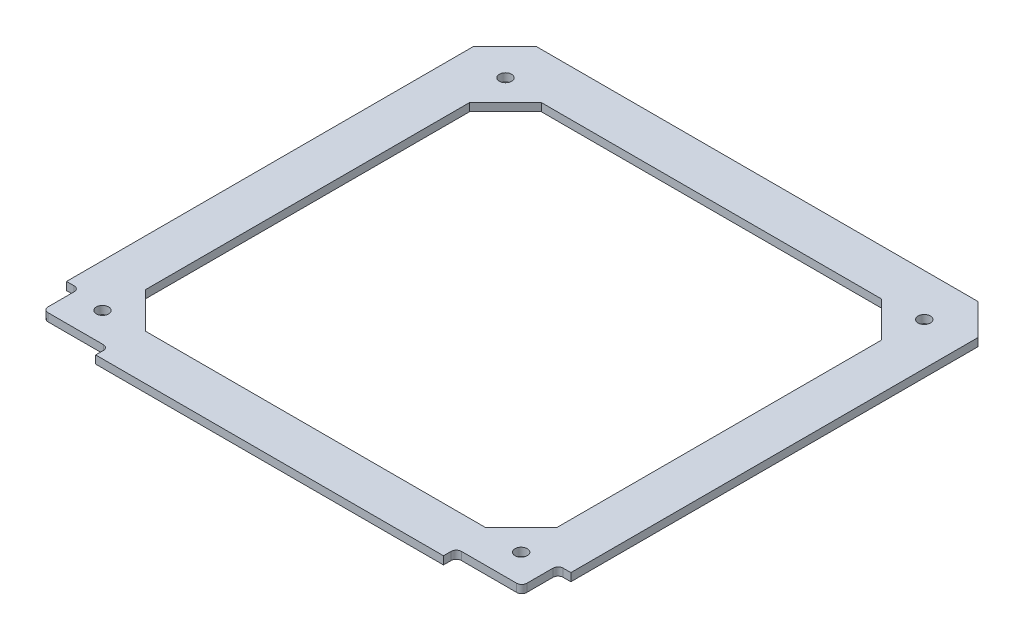
ISO-10303-21;
HEADER;
FILE_DESCRIPTION(('STEP AP214'),'2;1');
FILE_NAME('part.step','',(''),(''),'','','');
FILE_SCHEMA(('AUTOMOTIVE_DESIGN { 1 0 10303 214 1 1 1 1 }'));
ENDSEC;
DATA;
#1=APPLICATION_CONTEXT('core data for automotive mechanical design processes');
#2=APPLICATION_PROTOCOL_DEFINITION('international standard','automotive_design',2000,#1);
#3=PRODUCT_CONTEXT('',#1,'mechanical');
#4=PRODUCT('Part','Part','',(#3));
#5=PRODUCT_RELATED_PRODUCT_CATEGORY('part','',(#4));
#6=PRODUCT_DEFINITION_FORMATION('','',#4);
#7=PRODUCT_DEFINITION_CONTEXT('part definition',#1,'design');
#8=PRODUCT_DEFINITION('design','',#6,#7);
#9=PRODUCT_DEFINITION_SHAPE('','',#8);
#10=(LENGTH_UNIT() NAMED_UNIT(*) SI_UNIT(.MILLI.,.METRE.));
#11=(NAMED_UNIT(*) PLANE_ANGLE_UNIT() SI_UNIT($,.RADIAN.));
#12=(NAMED_UNIT(*) SI_UNIT($,.STERADIAN.) SOLID_ANGLE_UNIT());
#13=UNCERTAINTY_MEASURE_WITH_UNIT(LENGTH_MEASURE(1.E-05),#10,'distance_accuracy_value','');
#14=(GEOMETRIC_REPRESENTATION_CONTEXT(3) GLOBAL_UNCERTAINTY_ASSIGNED_CONTEXT((#13)) GLOBAL_UNIT_ASSIGNED_CONTEXT((#10,
#11,#12)) REPRESENTATION_CONTEXT('',''));
#15=CARTESIAN_POINT('',(0.,0.,0.));
#16=DIRECTION('',(0.,0.,1.));
#17=DIRECTION('',(1.,0.,0.));
#18=AXIS2_PLACEMENT_3D('',#15,#16,#17);
#19=CARTESIAN_POINT('',(-49.3566851962752,1.56,37.9952119756082));
#20=DIRECTION('',(1.,0.,0.));
#21=DIRECTION('',(0.,0.,-1.));
#22=AXIS2_PLACEMENT_3D('',#19,#20,#21);
#23=PLANE('',#22);
#24=DIRECTION('',(0.,0.,1.));
#25=VECTOR('',#24,1.);
#26=CARTESIAN_POINT('',(-49.3566851962752,0.,37.9952119756082));
#27=LINE('',#26,#25);
#28=CARTESIAN_POINT('',(-49.3566851962752,0.,-41.6047880243918));
#29=VERTEX_POINT('',#28);
#30=CARTESIAN_POINT('',(-49.3566851962752,0.,37.9952119756082));
#31=VERTEX_POINT('',#30);
#32=EDGE_CURVE('E280',#29,#31,#27,.T.);
#33=ORIENTED_EDGE('',*,*,#32,.T.);
#34=DIRECTION('',(0.,-1.,0.));
#35=VECTOR('',#34,1.);
#36=CARTESIAN_POINT('',(-49.3566851962752,1.56,37.9952119756082));
#37=LINE('',#36,#35);
#38=CARTESIAN_POINT('',(-49.3566851962752,1.56,37.9952119756082));
#39=VERTEX_POINT('',#38);
#40=EDGE_CURVE('E11',#39,#31,#37,.T.);
#41=ORIENTED_EDGE('',*,*,#40,.F.);
#42=DIRECTION('',(0.,0.,1.));
#43=VECTOR('',#42,1.);
#44=CARTESIAN_POINT('',(-49.3566851962752,1.56,37.9952119756082));
#45=LINE('',#44,#43);
#46=CARTESIAN_POINT('',(-49.3566851962752,1.56,-41.6047880243918));
#47=VERTEX_POINT('',#46);
#48=EDGE_CURVE('E292',#47,#39,#45,.T.);
#49=ORIENTED_EDGE('',*,*,#48,.F.);
#50=DIRECTION('',(0.,-1.,0.));
#51=VECTOR('',#50,1.);
#52=CARTESIAN_POINT('',(-49.3566851962752,1.56,-41.6047880243918));
#53=LINE('',#52,#51);
#54=EDGE_CURVE('E334',#47,#29,#53,.T.);
#55=ORIENTED_EDGE('',*,*,#54,.T.);
#56=EDGE_LOOP('',(#33,#41,#49,#55));
#57=FACE_BOUND('',#56,.T.);
#58=ADVANCED_FACE('F36',(#57),#23,.F.);
#59=CARTESIAN_POINT('',(-49.3566851962752,1.56,37.9952119756082));
#60=DIRECTION('',(0.,0.,-1.));
#61=DIRECTION('',(-1.,0.,0.));
#62=AXIS2_PLACEMENT_3D('',#59,#60,#61);
#63=PLANE('',#62);
#64=DIRECTION('',(1.,0.,0.));
#65=VECTOR('',#64,1.);
#66=CARTESIAN_POINT('',(-49.3566851962752,0.,37.9952119756082));
#67=LINE('',#66,#65);
#68=CARTESIAN_POINT('',(-47.8566851962753,0.,37.9952119756082));
#69=VERTEX_POINT('',#68);
#70=EDGE_CURVE('E337',#31,#69,#67,.T.);
#71=ORIENTED_EDGE('',*,*,#70,.T.);
#72=DIRECTION('',(0.,-1.,0.));
#73=VECTOR('',#72,1.);
#74=CARTESIAN_POINT('',(-47.8566851962753,1.56,37.9952119756082));
#75=LINE('',#74,#73);
#76=CARTESIAN_POINT('',(-47.8566851962753,1.56,37.9952119756082));
#77=VERTEX_POINT('',#76);
#78=EDGE_CURVE('E43',#77,#69,#75,.T.);
#79=ORIENTED_EDGE('',*,*,#78,.F.);
#80=DIRECTION('',(1.,0.,0.));
#81=VECTOR('',#80,1.);
#82=CARTESIAN_POINT('',(-49.3566851962752,1.56,37.9952119756082));
#83=LINE('',#82,#81);
#84=EDGE_CURVE('E295',#39,#77,#83,.T.);
#85=ORIENTED_EDGE('',*,*,#84,.F.);
#86=ORIENTED_EDGE('',*,*,#40,.T.);
#87=EDGE_LOOP('',(#71,#79,#85,#86));
#88=FACE_BOUND('',#87,.T.);
#89=ADVANCED_FACE('F452',(#88),#63,.F.);
#90=CARTESIAN_POINT('',(-47.8566851962752,1.56,38.9952119756082));
#91=DIRECTION('',(0.,-1.,0.));
#92=DIRECTION('',(0.,0.,-1.));
#93=AXIS2_PLACEMENT_3D('',#90,#91,#92);
#94=CYLINDRICAL_SURFACE('',#93,1.);
#95=CARTESIAN_POINT('',(-47.8566851962752,0.,38.9952119756082));
#96=DIRECTION('',(0.,-1.,0.));
#97=DIRECTION('',(0.,0.,1.));
#98=AXIS2_PLACEMENT_3D('',#95,#96,#97);
#99=CIRCLE('',#98,1.);
#100=CARTESIAN_POINT('',(-46.8566851962752,0.,38.9952119756082));
#101=VERTEX_POINT('',#100);
#102=EDGE_CURVE('E339',#69,#101,#99,.T.);
#103=ORIENTED_EDGE('',*,*,#102,.T.);
#104=DIRECTION('',(0.,-1.,0.));
#105=VECTOR('',#104,1.);
#106=CARTESIAN_POINT('',(-46.8566851962752,1.56,38.9952119756082));
#107=LINE('',#106,#105);
#108=CARTESIAN_POINT('',(-46.8566851962752,1.56,38.9952119756082));
#109=VERTEX_POINT('',#108);
#110=EDGE_CURVE('E424',#109,#101,#107,.T.);
#111=ORIENTED_EDGE('',*,*,#110,.F.);
#112=CARTESIAN_POINT('',(-47.8566851962752,1.56,38.9952119756082));
#113=DIRECTION('',(0.,-1.,0.));
#114=DIRECTION('',(0.,0.,1.));
#115=AXIS2_PLACEMENT_3D('',#112,#113,#114);
#116=CIRCLE('',#115,1.);
#117=EDGE_CURVE('E298',#77,#109,#116,.T.);
#118=ORIENTED_EDGE('',*,*,#117,.F.);
#119=ORIENTED_EDGE('',*,*,#78,.T.);
#120=EDGE_LOOP('',(#103,#111,#118,#119));
#121=FACE_BOUND('',#120,.T.);
#122=ADVANCED_FACE('F431',(#121),#94,.F.);
#123=CARTESIAN_POINT('',(-46.8566851962752,1.56,44.0952119756082));
#124=DIRECTION('',(1.,0.,0.));
#125=DIRECTION('',(0.,0.,-1.));
#126=AXIS2_PLACEMENT_3D('',#123,#124,#125);
#127=PLANE('',#126);
#128=DIRECTION('',(0.,0.,1.));
#129=VECTOR('',#128,1.);
#130=CARTESIAN_POINT('',(-46.8566851962752,0.,44.0952119756082));
#131=LINE('',#130,#129);
#132=CARTESIAN_POINT('',(-46.8566851962752,0.,44.0952119756082));
#133=VERTEX_POINT('',#132);
#134=EDGE_CURVE('E341',#101,#133,#131,.T.);
#135=ORIENTED_EDGE('',*,*,#134,.T.);
#136=DIRECTION('',(0.,-1.,0.));
#137=VECTOR('',#136,1.);
#138=CARTESIAN_POINT('',(-46.8566851962752,1.56,44.0952119756082));
#139=LINE('',#138,#137);
#140=CARTESIAN_POINT('',(-46.8566851962752,1.56,44.0952119756082));
#141=VERTEX_POINT('',#140);
#142=EDGE_CURVE('E421',#141,#133,#139,.T.);
#143=ORIENTED_EDGE('',*,*,#142,.F.);
#144=DIRECTION('',(0.,0.,1.));
#145=VECTOR('',#144,1.);
#146=CARTESIAN_POINT('',(-46.8566851962752,1.56,44.0952119756082));
#147=LINE('',#146,#145);
#148=EDGE_CURVE('E300',#109,#141,#147,.T.);
#149=ORIENTED_EDGE('',*,*,#148,.F.);
#150=ORIENTED_EDGE('',*,*,#110,.T.);
#151=EDGE_LOOP('',(#135,#143,#149,#150));
#152=FACE_BOUND('',#151,.T.);
#153=ADVANCED_FACE('F440',(#152),#127,.F.);
#154=CARTESIAN_POINT('',(-45.8566851962752,1.56,44.0952119756082));
#155=DIRECTION('',(0.,-1.,0.));
#156=DIRECTION('',(0.,0.,-1.));
#157=AXIS2_PLACEMENT_3D('',#154,#155,#156);
#158=CYLINDRICAL_SURFACE('',#157,1.);
#159=CARTESIAN_POINT('',(-45.8566851962752,0.,44.0952119756082));
#160=DIRECTION('',(0.,1.,0.));
#161=DIRECTION('',(0.,0.,-1.));
#162=AXIS2_PLACEMENT_3D('',#159,#160,#161);
#163=CIRCLE('',#162,1.);
#164=CARTESIAN_POINT('',(-45.8566851962752,0.,45.0952119756082));
#165=VERTEX_POINT('',#164);
#166=EDGE_CURVE('E343',#133,#165,#163,.T.);
#167=ORIENTED_EDGE('',*,*,#166,.T.);
#168=DIRECTION('',(0.,-1.,0.));
#169=VECTOR('',#168,1.);
#170=CARTESIAN_POINT('',(-45.8566851962752,1.56,45.0952119756082));
#171=LINE('',#170,#169);
#172=CARTESIAN_POINT('',(-45.8566851962752,1.56,45.0952119756082));
#173=VERTEX_POINT('',#172);
#174=EDGE_CURVE('E418',#173,#165,#171,.T.);
#175=ORIENTED_EDGE('',*,*,#174,.F.);
#176=CARTESIAN_POINT('',(-45.8566851962752,1.56,44.0952119756082));
#177=DIRECTION('',(0.,1.,0.));
#178=DIRECTION('',(0.,0.,-1.));
#179=AXIS2_PLACEMENT_3D('',#176,#177,#178);
#180=CIRCLE('',#179,1.);
#181=EDGE_CURVE('E302',#141,#173,#180,.T.);
#182=ORIENTED_EDGE('',*,*,#181,.F.);
#183=ORIENTED_EDGE('',*,*,#142,.T.);
#184=EDGE_LOOP('',(#167,#175,#182,#183));
#185=FACE_BOUND('',#184,.T.);
#186=ADVANCED_FACE('F444',(#185),#158,.T.);
#187=CARTESIAN_POINT('',(-45.8566851962752,1.56,45.0952119756082));
#188=DIRECTION('',(0.,0.,-1.));
#189=DIRECTION('',(-1.,0.,0.));
#190=AXIS2_PLACEMENT_3D('',#187,#188,#189);
#191=PLANE('',#190);
#192=DIRECTION('',(1.,0.,0.));
#193=VECTOR('',#192,1.);
#194=CARTESIAN_POINT('',(-45.8566851962752,0.,45.0952119756082));
#195=LINE('',#194,#193);
#196=CARTESIAN_POINT('',(-35.0566851962753,0.,45.0952119756082));
#197=VERTEX_POINT('',#196);
#198=EDGE_CURVE('E345',#165,#197,#195,.T.);
#199=ORIENTED_EDGE('',*,*,#198,.T.);
#200=DIRECTION('',(0.,-1.,0.));
#201=VECTOR('',#200,1.);
#202=CARTESIAN_POINT('',(-35.0566851962753,1.56,45.0952119756082));
#203=LINE('',#202,#201);
#204=CARTESIAN_POINT('',(-35.0566851962753,1.56,45.0952119756082));
#205=VERTEX_POINT('',#204);
#206=EDGE_CURVE('E415',#205,#197,#203,.T.);
#207=ORIENTED_EDGE('',*,*,#206,.F.);
#208=DIRECTION('',(1.,0.,0.));
#209=VECTOR('',#208,1.);
#210=CARTESIAN_POINT('',(-45.8566851962752,1.56,45.0952119756082));
#211=LINE('',#210,#209);
#212=EDGE_CURVE('E304',#173,#205,#211,.T.);
#213=ORIENTED_EDGE('',*,*,#212,.F.);
#214=ORIENTED_EDGE('',*,*,#174,.T.);
#215=EDGE_LOOP('',(#199,#207,#213,#214));
#216=FACE_BOUND('',#215,.T.);
#217=ADVANCED_FACE('F525',(#216),#191,.F.);
#218=CARTESIAN_POINT('',(-35.0566851962752,1.56,46.0952119756082));
#219=DIRECTION('',(0.,-1.,0.));
#220=DIRECTION('',(0.,0.,-1.));
#221=AXIS2_PLACEMENT_3D('',#218,#219,#220);
#222=CYLINDRICAL_SURFACE('',#221,1.);
#223=CARTESIAN_POINT('',(-35.0566851962752,0.,46.0952119756082));
#224=DIRECTION('',(0.,-1.,0.));
#225=DIRECTION('',(0.,0.,1.));
#226=AXIS2_PLACEMENT_3D('',#223,#224,#225);
#227=CIRCLE('',#226,1.);
#228=CARTESIAN_POINT('',(-34.0566851962752,0.,46.0952119756082));
#229=VERTEX_POINT('',#228);
#230=EDGE_CURVE('E347',#197,#229,#227,.T.);
#231=ORIENTED_EDGE('',*,*,#230,.T.);
#232=DIRECTION('',(0.,-1.,0.));
#233=VECTOR('',#232,1.);
#234=CARTESIAN_POINT('',(-34.0566851962752,1.56,46.0952119756082));
#235=LINE('',#234,#233);
#236=CARTESIAN_POINT('',(-34.0566851962752,1.56,46.0952119756082));
#237=VERTEX_POINT('',#236);
#238=EDGE_CURVE('E412',#237,#229,#235,.T.);
#239=ORIENTED_EDGE('',*,*,#238,.F.);
#240=CARTESIAN_POINT('',(-35.0566851962752,1.56,46.0952119756082));
#241=DIRECTION('',(0.,-1.,0.));
#242=DIRECTION('',(0.,0.,1.));
#243=AXIS2_PLACEMENT_3D('',#240,#241,#242);
#244=CIRCLE('',#243,1.);
#245=EDGE_CURVE('E306',#205,#237,#244,.T.);
#246=ORIENTED_EDGE('',*,*,#245,.F.);
#247=ORIENTED_EDGE('',*,*,#206,.T.);
#248=EDGE_LOOP('',(#231,#239,#246,#247));
#249=FACE_BOUND('',#248,.T.);
#250=ADVANCED_FACE('F523',(#249),#222,.F.);
#251=CARTESIAN_POINT('',(-34.0566851962752,1.56,47.5952119756082));
#252=DIRECTION('',(1.,0.,0.));
#253=DIRECTION('',(0.,0.,-1.));
#254=AXIS2_PLACEMENT_3D('',#251,#252,#253);
#255=PLANE('',#254);
#256=DIRECTION('',(0.,0.,1.));
#257=VECTOR('',#256,1.);
#258=CARTESIAN_POINT('',(-34.0566851962752,0.,47.5952119756082));
#259=LINE('',#258,#257);
#260=CARTESIAN_POINT('',(-34.0566851962752,0.,47.5952119756082));
#261=VERTEX_POINT('',#260);
#262=EDGE_CURVE('E349',#229,#261,#259,.T.);
#263=ORIENTED_EDGE('',*,*,#262,.T.);
#264=DIRECTION('',(0.,-1.,0.));
#265=VECTOR('',#264,1.);
#266=CARTESIAN_POINT('',(-34.0566851962752,1.56,47.5952119756082));
#267=LINE('',#266,#265);
#268=CARTESIAN_POINT('',(-34.0566851962752,1.56,47.5952119756082));
#269=VERTEX_POINT('',#268);
#270=EDGE_CURVE('E409',#269,#261,#267,.T.);
#271=ORIENTED_EDGE('',*,*,#270,.F.);
#272=DIRECTION('',(0.,0.,1.));
#273=VECTOR('',#272,1.);
#274=CARTESIAN_POINT('',(-34.0566851962752,1.56,47.5952119756082));
#275=LINE('',#274,#273);
#276=EDGE_CURVE('E308',#237,#269,#275,.T.);
#277=ORIENTED_EDGE('',*,*,#276,.F.);
#278=ORIENTED_EDGE('',*,*,#238,.T.);
#279=EDGE_LOOP('',(#263,#271,#277,#278));
#280=FACE_BOUND('',#279,.T.);
#281=ADVANCED_FACE('F518',(#280),#255,.F.);
#282=CARTESIAN_POINT('',(-34.0566851962752,1.56,47.5952119756082));
#283=DIRECTION('',(0.,0.,-1.));
#284=DIRECTION('',(-1.,0.,0.));
#285=AXIS2_PLACEMENT_3D('',#282,#283,#284);
#286=PLANE('',#285);
#287=DIRECTION('',(1.,0.,0.));
#288=VECTOR('',#287,1.);
#289=CARTESIAN_POINT('',(-34.0566851962752,0.,47.5952119756082));
#290=LINE('',#289,#288);
#291=CARTESIAN_POINT('',(33.9433148037247,0.,47.5952119756082));
#292=VERTEX_POINT('',#291);
#293=EDGE_CURVE('E351',#261,#292,#290,.T.);
#294=ORIENTED_EDGE('',*,*,#293,.T.);
#295=DIRECTION('',(0.,-1.,0.));
#296=VECTOR('',#295,1.);
#297=CARTESIAN_POINT('',(33.9433148037247,1.56,47.5952119756082));
#298=LINE('',#297,#296);
#299=CARTESIAN_POINT('',(33.9433148037247,1.56,47.5952119756082));
#300=VERTEX_POINT('',#299);
#301=EDGE_CURVE('E406',#300,#292,#298,.T.);
#302=ORIENTED_EDGE('',*,*,#301,.F.);
#303=DIRECTION('',(1.,0.,0.));
#304=VECTOR('',#303,1.);
#305=CARTESIAN_POINT('',(-34.0566851962752,1.56,47.5952119756082));
#306=LINE('',#305,#304);
#307=EDGE_CURVE('E310',#269,#300,#306,.T.);
#308=ORIENTED_EDGE('',*,*,#307,.F.);
#309=ORIENTED_EDGE('',*,*,#270,.T.);
#310=EDGE_LOOP('',(#294,#302,#308,#309));
#311=FACE_BOUND('',#310,.T.);
#312=ADVANCED_FACE('F513',(#311),#286,.F.);
#313=CARTESIAN_POINT('',(33.9433148037247,1.56,47.5952119756082));
#314=DIRECTION('',(-1.,0.,0.));
#315=DIRECTION('',(0.,0.,1.));
#316=AXIS2_PLACEMENT_3D('',#313,#314,#315);
#317=PLANE('',#316);
#318=DIRECTION('',(0.,0.,-1.));
#319=VECTOR('',#318,1.);
#320=CARTESIAN_POINT('',(33.9433148037247,0.,47.5952119756082));
#321=LINE('',#320,#319);
#322=CARTESIAN_POINT('',(33.9433148037247,0.,46.0952119756082));
#323=VERTEX_POINT('',#322);
#324=EDGE_CURVE('E353',#292,#323,#321,.T.);
#325=ORIENTED_EDGE('',*,*,#324,.T.);
#326=DIRECTION('',(0.,-1.,0.));
#327=VECTOR('',#326,1.);
#328=CARTESIAN_POINT('',(33.9433148037247,1.56,46.0952119756082));
#329=LINE('',#328,#327);
#330=CARTESIAN_POINT('',(33.9433148037247,1.56,46.0952119756082));
#331=VERTEX_POINT('',#330);
#332=EDGE_CURVE('E403',#331,#323,#329,.T.);
#333=ORIENTED_EDGE('',*,*,#332,.F.);
#334=DIRECTION('',(0.,0.,-1.));
#335=VECTOR('',#334,1.);
#336=CARTESIAN_POINT('',(33.9433148037247,1.56,47.5952119756082));
#337=LINE('',#336,#335);
#338=EDGE_CURVE('E312',#300,#331,#337,.T.);
#339=ORIENTED_EDGE('',*,*,#338,.F.);
#340=ORIENTED_EDGE('',*,*,#301,.T.);
#341=EDGE_LOOP('',(#325,#333,#339,#340));
#342=FACE_BOUND('',#341,.T.);
#343=ADVANCED_FACE('F509',(#342),#317,.F.);
#344=CARTESIAN_POINT('',(34.9433148037247,1.56,46.0952119756082));
#345=DIRECTION('',(0.,-1.,0.));
#346=DIRECTION('',(0.,0.,-1.));
#347=AXIS2_PLACEMENT_3D('',#344,#345,#346);
#348=CYLINDRICAL_SURFACE('',#347,1.);
#349=CARTESIAN_POINT('',(34.9433148037247,0.,46.0952119756082));
#350=DIRECTION('',(0.,-1.,0.));
#351=DIRECTION('',(0.,0.,1.));
#352=AXIS2_PLACEMENT_3D('',#349,#350,#351);
#353=CIRCLE('',#352,1.);
#354=CARTESIAN_POINT('',(34.9433148037248,0.,45.0952119756082));
#355=VERTEX_POINT('',#354);
#356=EDGE_CURVE('E355',#323,#355,#353,.T.);
#357=ORIENTED_EDGE('',*,*,#356,.T.);
#358=DIRECTION('',(0.,-1.,0.));
#359=VECTOR('',#358,1.);
#360=CARTESIAN_POINT('',(34.9433148037248,1.56,45.0952119756082));
#361=LINE('',#360,#359);
#362=CARTESIAN_POINT('',(34.9433148037248,1.56,45.0952119756082));
#363=VERTEX_POINT('',#362);
#364=EDGE_CURVE('E400',#363,#355,#361,.T.);
#365=ORIENTED_EDGE('',*,*,#364,.F.);
#366=CARTESIAN_POINT('',(34.9433148037247,1.56,46.0952119756082));
#367=DIRECTION('',(0.,-1.,0.));
#368=DIRECTION('',(0.,0.,1.));
#369=AXIS2_PLACEMENT_3D('',#366,#367,#368);
#370=CIRCLE('',#369,1.);
#371=EDGE_CURVE('E314',#331,#363,#370,.T.);
#372=ORIENTED_EDGE('',*,*,#371,.F.);
#373=ORIENTED_EDGE('',*,*,#332,.T.);
#374=EDGE_LOOP('',(#357,#365,#372,#373));
#375=FACE_BOUND('',#374,.T.);
#376=ADVANCED_FACE('F504',(#375),#348,.F.);
#377=CARTESIAN_POINT('',(34.9433148037248,1.56,45.0952119756082));
#378=DIRECTION('',(0.,0.,-1.));
#379=DIRECTION('',(-1.,0.,0.));
#380=AXIS2_PLACEMENT_3D('',#377,#378,#379);
#381=PLANE('',#380);
#382=DIRECTION('',(1.,0.,0.));
#383=VECTOR('',#382,1.);
#384=CARTESIAN_POINT('',(34.9433148037248,0.,45.0952119756082));
#385=LINE('',#384,#383);
#386=CARTESIAN_POINT('',(45.7433148037247,0.,45.0952119756082));
#387=VERTEX_POINT('',#386);
#388=EDGE_CURVE('E357',#355,#387,#385,.T.);
#389=ORIENTED_EDGE('',*,*,#388,.T.);
#390=DIRECTION('',(0.,-1.,0.));
#391=VECTOR('',#390,1.);
#392=CARTESIAN_POINT('',(45.7433148037247,1.56,45.0952119756082));
#393=LINE('',#392,#391);
#394=CARTESIAN_POINT('',(45.7433148037247,1.56,45.0952119756082));
#395=VERTEX_POINT('',#394);
#396=EDGE_CURVE('E397',#395,#387,#393,.T.);
#397=ORIENTED_EDGE('',*,*,#396,.F.);
#398=DIRECTION('',(1.,0.,0.));
#399=VECTOR('',#398,1.);
#400=CARTESIAN_POINT('',(34.9433148037248,1.56,45.0952119756082));
#401=LINE('',#400,#399);
#402=EDGE_CURVE('E316',#363,#395,#401,.T.);
#403=ORIENTED_EDGE('',*,*,#402,.F.);
#404=ORIENTED_EDGE('',*,*,#364,.T.);
#405=EDGE_LOOP('',(#389,#397,#403,#404));
#406=FACE_BOUND('',#405,.T.);
#407=ADVANCED_FACE('F498',(#406),#381,.F.);
#408=CARTESIAN_POINT('',(45.7433148037247,1.56,44.0952119756082));
#409=DIRECTION('',(0.,-1.,0.));
#410=DIRECTION('',(0.,0.,-1.));
#411=AXIS2_PLACEMENT_3D('',#408,#409,#410);
#412=CYLINDRICAL_SURFACE('',#411,1.);
#413=CARTESIAN_POINT('',(45.7433148037247,0.,44.0952119756082));
#414=DIRECTION('',(0.,1.,0.));
#415=DIRECTION('',(0.,0.,-1.));
#416=AXIS2_PLACEMENT_3D('',#413,#414,#415);
#417=CIRCLE('',#416,1.);
#418=CARTESIAN_POINT('',(46.7433148037248,0.,44.0952119756082));
#419=VERTEX_POINT('',#418);
#420=EDGE_CURVE('E359',#387,#419,#417,.T.);
#421=ORIENTED_EDGE('',*,*,#420,.T.);
#422=DIRECTION('',(0.,-1.,0.));
#423=VECTOR('',#422,1.);
#424=CARTESIAN_POINT('',(46.7433148037248,1.56,44.0952119756082));
#425=LINE('',#424,#423);
#426=CARTESIAN_POINT('',(46.7433148037248,1.56,44.0952119756082));
#427=VERTEX_POINT('',#426);
#428=EDGE_CURVE('E394',#427,#419,#425,.T.);
#429=ORIENTED_EDGE('',*,*,#428,.F.);
#430=CARTESIAN_POINT('',(45.7433148037247,1.56,44.0952119756082));
#431=DIRECTION('',(0.,1.,0.));
#432=DIRECTION('',(0.,0.,-1.));
#433=AXIS2_PLACEMENT_3D('',#430,#431,#432);
#434=CIRCLE('',#433,1.);
#435=EDGE_CURVE('E318',#395,#427,#434,.T.);
#436=ORIENTED_EDGE('',*,*,#435,.F.);
#437=ORIENTED_EDGE('',*,*,#396,.T.);
#438=EDGE_LOOP('',(#421,#429,#436,#437));
#439=FACE_BOUND('',#438,.T.);
#440=ADVANCED_FACE('F494',(#439),#412,.T.);
#441=CARTESIAN_POINT('',(46.7433148037248,1.56,44.0952119756082));
#442=DIRECTION('',(-1.,0.,0.));
#443=DIRECTION('',(0.,0.,1.));
#444=AXIS2_PLACEMENT_3D('',#441,#442,#443);
#445=PLANE('',#444);
#446=DIRECTION('',(0.,0.,-1.));
#447=VECTOR('',#446,1.);
#448=CARTESIAN_POINT('',(46.7433148037248,0.,44.0952119756082));
#449=LINE('',#448,#447);
#450=CARTESIAN_POINT('',(46.7433148037248,0.,38.9952119756082));
#451=VERTEX_POINT('',#450);
#452=EDGE_CURVE('E361',#419,#451,#449,.T.);
#453=ORIENTED_EDGE('',*,*,#452,.T.);
#454=DIRECTION('',(0.,-1.,0.));
#455=VECTOR('',#454,1.);
#456=CARTESIAN_POINT('',(46.7433148037248,1.56,38.9952119756082));
#457=LINE('',#456,#455);
#458=CARTESIAN_POINT('',(46.7433148037248,1.56,38.9952119756082));
#459=VERTEX_POINT('',#458);
#460=EDGE_CURVE('E391',#459,#451,#457,.T.);
#461=ORIENTED_EDGE('',*,*,#460,.F.);
#462=DIRECTION('',(0.,0.,-1.));
#463=VECTOR('',#462,1.);
#464=CARTESIAN_POINT('',(46.7433148037248,1.56,44.0952119756082));
#465=LINE('',#464,#463);
#466=EDGE_CURVE('E320',#427,#459,#465,.T.);
#467=ORIENTED_EDGE('',*,*,#466,.F.);
#468=ORIENTED_EDGE('',*,*,#428,.T.);
#469=EDGE_LOOP('',(#453,#461,#467,#468));
#470=FACE_BOUND('',#469,.T.);
#471=ADVANCED_FACE('F489',(#470),#445,.F.);
#472=CARTESIAN_POINT('',(47.7433148037248,1.56,38.9952119756082));
#473=DIRECTION('',(0.,-1.,0.));
#474=DIRECTION('',(0.,0.,-1.));
#475=AXIS2_PLACEMENT_3D('',#472,#473,#474);
#476=CYLINDRICAL_SURFACE('',#475,1.);
#477=CARTESIAN_POINT('',(47.7433148037248,0.,38.9952119756082));
#478=DIRECTION('',(0.,-1.,0.));
#479=DIRECTION('',(0.,0.,1.));
#480=AXIS2_PLACEMENT_3D('',#477,#478,#479);
#481=CIRCLE('',#480,1.);
#482=CARTESIAN_POINT('',(47.7433148037248,0.,37.9952119756082));
#483=VERTEX_POINT('',#482);
#484=EDGE_CURVE('E363',#451,#483,#481,.T.);
#485=ORIENTED_EDGE('',*,*,#484,.T.);
#486=DIRECTION('',(0.,-1.,0.));
#487=VECTOR('',#486,1.);
#488=CARTESIAN_POINT('',(47.7433148037248,1.56,37.9952119756082));
#489=LINE('',#488,#487);
#490=CARTESIAN_POINT('',(47.7433148037248,1.56,37.9952119756082));
#491=VERTEX_POINT('',#490);
#492=EDGE_CURVE('E388',#491,#483,#489,.T.);
#493=ORIENTED_EDGE('',*,*,#492,.F.);
#494=CARTESIAN_POINT('',(47.7433148037248,1.56,38.9952119756082));
#495=DIRECTION('',(0.,-1.,0.));
#496=DIRECTION('',(0.,0.,1.));
#497=AXIS2_PLACEMENT_3D('',#494,#495,#496);
#498=CIRCLE('',#497,1.);
#499=EDGE_CURVE('E322',#459,#491,#498,.T.);
#500=ORIENTED_EDGE('',*,*,#499,.F.);
#501=ORIENTED_EDGE('',*,*,#460,.T.);
#502=EDGE_LOOP('',(#485,#493,#500,#501));
#503=FACE_BOUND('',#502,.T.);
#504=ADVANCED_FACE('F483',(#503),#476,.F.);
#505=CARTESIAN_POINT('',(49.2433148037248,1.56,37.9952119756082));
#506=DIRECTION('',(0.,0.,-1.));
#507=DIRECTION('',(-1.,0.,0.));
#508=AXIS2_PLACEMENT_3D('',#505,#506,#507);
#509=PLANE('',#508);
#510=DIRECTION('',(1.,0.,0.));
#511=VECTOR('',#510,1.);
#512=CARTESIAN_POINT('',(49.2433148037248,0.,37.9952119756082));
#513=LINE('',#512,#511);
#514=CARTESIAN_POINT('',(49.2433148037248,0.,37.9952119756082));
#515=VERTEX_POINT('',#514);
#516=EDGE_CURVE('E365',#483,#515,#513,.T.);
#517=ORIENTED_EDGE('',*,*,#516,.T.);
#518=DIRECTION('',(0.,-1.,0.));
#519=VECTOR('',#518,1.);
#520=CARTESIAN_POINT('',(49.2433148037248,1.56,37.9952119756082));
#521=LINE('',#520,#519);
#522=CARTESIAN_POINT('',(49.2433148037248,1.56,37.9952119756082));
#523=VERTEX_POINT('',#522);
#524=EDGE_CURVE('E385',#523,#515,#521,.T.);
#525=ORIENTED_EDGE('',*,*,#524,.F.);
#526=DIRECTION('',(1.,0.,0.));
#527=VECTOR('',#526,1.);
#528=CARTESIAN_POINT('',(49.2433148037248,1.56,37.9952119756082));
#529=LINE('',#528,#527);
#530=EDGE_CURVE('E324',#491,#523,#529,.T.);
#531=ORIENTED_EDGE('',*,*,#530,.F.);
#532=ORIENTED_EDGE('',*,*,#492,.T.);
#533=EDGE_LOOP('',(#517,#525,#531,#532));
#534=FACE_BOUND('',#533,.T.);
#535=ADVANCED_FACE('F479',(#534),#509,.F.);
#536=CARTESIAN_POINT('',(49.2433148037248,1.56,37.9952119756082));
#537=DIRECTION('',(-1.,0.,0.));
#538=DIRECTION('',(0.,0.,1.));
#539=AXIS2_PLACEMENT_3D('',#536,#537,#538);
#540=PLANE('',#539);
#541=DIRECTION('',(0.,0.,-1.));
#542=VECTOR('',#541,1.);
#543=CARTESIAN_POINT('',(49.2433148037248,0.,37.9952119756082));
#544=LINE('',#543,#542);
#545=CARTESIAN_POINT('',(49.2433148037247,0.,-41.6047880243918));
#546=VERTEX_POINT('',#545);
#547=EDGE_CURVE('E367',#515,#546,#544,.T.);
#548=ORIENTED_EDGE('',*,*,#547,.T.);
#549=DIRECTION('',(0.,-1.,0.));
#550=VECTOR('',#549,1.);
#551=CARTESIAN_POINT('',(49.2433148037247,1.56,-41.6047880243918));
#552=LINE('',#551,#550);
#553=CARTESIAN_POINT('',(49.2433148037247,1.56,-41.6047880243918));
#554=VERTEX_POINT('',#553);
#555=EDGE_CURVE('E382',#554,#546,#552,.T.);
#556=ORIENTED_EDGE('',*,*,#555,.F.);
#557=DIRECTION('',(0.,0.,-1.));
#558=VECTOR('',#557,1.);
#559=CARTESIAN_POINT('',(49.2433148037248,1.56,37.9952119756082));
#560=LINE('',#559,#558);
#561=EDGE_CURVE('E326',#523,#554,#560,.T.);
#562=ORIENTED_EDGE('',*,*,#561,.F.);
#563=ORIENTED_EDGE('',*,*,#524,.T.);
#564=EDGE_LOOP('',(#548,#556,#562,#563));
#565=FACE_BOUND('',#564,.T.);
#566=ADVANCED_FACE('F474',(#565),#540,.F.);
#567=CARTESIAN_POINT('',(49.2433148037247,1.56,-41.6047880243918));
#568=DIRECTION('',(-0.707106781186547,0.,0.707106781186547));
#569=DIRECTION('',(0.707106781186548,0.,0.707106781186548));
#570=AXIS2_PLACEMENT_3D('',#567,#568,#569);
#571=PLANE('',#570);
#572=DIRECTION('',(-0.707106781186548,0.,-0.707106781186548));
#573=VECTOR('',#572,1.);
#574=CARTESIAN_POINT('',(49.2433148037247,0.,-41.6047880243918));
#575=LINE('',#574,#573);
#576=CARTESIAN_POINT('',(43.1433148037247,0.,-47.7047880243918));
#577=VERTEX_POINT('',#576);
#578=EDGE_CURVE('E369',#546,#577,#575,.T.);
#579=ORIENTED_EDGE('',*,*,#578,.T.);
#580=DIRECTION('',(0.,-1.,0.));
#581=VECTOR('',#580,1.);
#582=CARTESIAN_POINT('',(43.1433148037247,1.56,-47.7047880243918));
#583=LINE('',#582,#581);
#584=CARTESIAN_POINT('',(43.1433148037247,1.56,-47.7047880243918));
#585=VERTEX_POINT('',#584);
#586=EDGE_CURVE('E379',#585,#577,#583,.T.);
#587=ORIENTED_EDGE('',*,*,#586,.F.);
#588=DIRECTION('',(-0.707106781186548,0.,-0.707106781186548));
#589=VECTOR('',#588,1.);
#590=CARTESIAN_POINT('',(49.2433148037247,1.56,-41.6047880243918));
#591=LINE('',#590,#589);
#592=EDGE_CURVE('E328',#554,#585,#591,.T.);
#593=ORIENTED_EDGE('',*,*,#592,.F.);
#594=ORIENTED_EDGE('',*,*,#555,.T.);
#595=EDGE_LOOP('',(#579,#587,#593,#594));
#596=FACE_BOUND('',#595,.T.);
#597=ADVANCED_FACE('F468',(#596),#571,.F.);
#598=CARTESIAN_POINT('',(-43.2566851962752,1.56,-47.7047880243918));
#599=DIRECTION('',(0.,0.,1.));
#600=DIRECTION('',(1.,0.,0.));
#601=AXIS2_PLACEMENT_3D('',#598,#599,#600);
#602=PLANE('',#601);
#603=DIRECTION('',(-1.,0.,0.));
#604=VECTOR('',#603,1.);
#605=CARTESIAN_POINT('',(-43.2566851962752,0.,-47.7047880243918));
#606=LINE('',#605,#604);
#607=CARTESIAN_POINT('',(-43.2566851962752,0.,-47.7047880243918));
#608=VERTEX_POINT('',#607);
#609=EDGE_CURVE('E371',#577,#608,#606,.T.);
#610=ORIENTED_EDGE('',*,*,#609,.T.);
#611=DIRECTION('',(0.,-1.,0.));
#612=VECTOR('',#611,1.);
#613=CARTESIAN_POINT('',(-43.2566851962752,1.56,-47.7047880243918));
#614=LINE('',#613,#612);
#615=CARTESIAN_POINT('',(-43.2566851962752,1.56,-47.7047880243918));
#616=VERTEX_POINT('',#615);
#617=EDGE_CURVE('E376',#616,#608,#614,.T.);
#618=ORIENTED_EDGE('',*,*,#617,.F.);
#619=DIRECTION('',(-1.,0.,0.));
#620=VECTOR('',#619,1.);
#621=CARTESIAN_POINT('',(-43.2566851962752,1.56,-47.7047880243918));
#622=LINE('',#621,#620);
#623=EDGE_CURVE('E330',#585,#616,#622,.T.);
#624=ORIENTED_EDGE('',*,*,#623,.F.);
#625=ORIENTED_EDGE('',*,*,#586,.T.);
#626=EDGE_LOOP('',(#610,#618,#624,#625));
#627=FACE_BOUND('',#626,.T.);
#628=ADVANCED_FACE('F464',(#627),#602,.F.);
#629=CARTESIAN_POINT('',(-49.3566851962752,1.56,-41.6047880243918));
#630=DIRECTION('',(0.707106781186548,0.,0.707106781186547));
#631=DIRECTION('',(0.707106781186547,0.,-0.707106781186548));
#632=AXIS2_PLACEMENT_3D('',#629,#630,#631);
#633=PLANE('',#632);
#634=DIRECTION('',(-0.707106781186547,0.,0.707106781186548));
#635=VECTOR('',#634,1.);
#636=CARTESIAN_POINT('',(-49.3566851962752,0.,-41.6047880243918));
#637=LINE('',#636,#635);
#638=EDGE_CURVE('E296',#608,#29,#637,.T.);
#639=ORIENTED_EDGE('',*,*,#638,.T.);
#640=ORIENTED_EDGE('',*,*,#54,.F.);
#641=DIRECTION('',(-0.707106781186547,0.,0.707106781186548));
#642=VECTOR('',#641,1.);
#643=CARTESIAN_POINT('',(-49.3566851962752,1.56,-41.6047880243918));
#644=LINE('',#643,#642);
#645=EDGE_CURVE('E332',#616,#47,#644,.T.);
#646=ORIENTED_EDGE('',*,*,#645,.F.);
#647=ORIENTED_EDGE('',*,*,#617,.T.);
#648=EDGE_LOOP('',(#639,#640,#646,#647));
#649=FACE_BOUND('',#648,.T.);
#650=ADVANCED_FACE('F459',(#649),#633,.F.);
#651=CARTESIAN_POINT('',(47.7433148037248,1.56,38.9952119756082));
#652=DIRECTION('',(0.,1.,0.));
#653=DIRECTION('',(0.,0.,1.));
#654=AXIS2_PLACEMENT_3D('',#651,#652,#653);
#655=PLANE('',#654);
#656=CARTESIAN_POINT('',(40.9294911490461,1.56,-39.3973711595096));
#657=DIRECTION('',(0.,1.,0.));
#658=DIRECTION('',(0.,0.,1.));
#659=AXIS2_PLACEMENT_3D('',#656,#657,#658);
#660=CIRCLE('',#659,1.19999999999999);
#661=CARTESIAN_POINT('',(40.9294911490461,1.56,-38.1973711595096));
#662=VERTEX_POINT('',#661);
#663=EDGE_CURVE('E808',#662,#662,#660,.T.);
#664=ORIENTED_EDGE('',*,*,#663,.F.);
#665=EDGE_LOOP('',(#664));
#666=FACE_BOUND('',#665,.T.);
#667=CARTESIAN_POINT('',(40.9294911490461,1.56,39.3973711595096));
#668=DIRECTION('',(0.,1.,0.));
#669=DIRECTION('',(0.,0.,1.));
#670=AXIS2_PLACEMENT_3D('',#667,#668,#669);
#671=CIRCLE('',#670,1.19999999999999);
#672=CARTESIAN_POINT('',(40.9294911490461,1.56,40.5973711595096));
#673=VERTEX_POINT('',#672);
#674=EDGE_CURVE('E812',#673,#673,#671,.T.);
#675=ORIENTED_EDGE('',*,*,#674,.F.);
#676=EDGE_LOOP('',(#675));
#677=FACE_BOUND('',#676,.T.);
#678=CARTESIAN_POINT('',(-40.9294911490461,1.56,39.3973711595096));
#679=DIRECTION('',(0.,1.,0.));
#680=DIRECTION('',(0.,0.,1.));
#681=AXIS2_PLACEMENT_3D('',#678,#679,#680);
#682=CIRCLE('',#681,1.19999999999999);
#683=CARTESIAN_POINT('',(-40.9294911490461,1.56,40.5973711595096));
#684=VERTEX_POINT('',#683);
#685=EDGE_CURVE('E821',#684,#684,#682,.T.);
#686=ORIENTED_EDGE('',*,*,#685,.F.);
#687=EDGE_LOOP('',(#686));
#688=FACE_BOUND('',#687,.T.);
#689=CARTESIAN_POINT('',(-40.9294911490461,1.56,-39.3973711595096));
#690=DIRECTION('',(0.,1.,0.));
#691=DIRECTION('',(0.,0.,1.));
#692=AXIS2_PLACEMENT_3D('',#689,#690,#691);
#693=CIRCLE('',#692,1.19999999999999);
#694=CARTESIAN_POINT('',(-40.9294911490461,1.56,-38.1973711595096));
#695=VERTEX_POINT('',#694);
#696=EDGE_CURVE('E826',#695,#695,#693,.T.);
#697=ORIENTED_EDGE('',*,*,#696,.F.);
#698=EDGE_LOOP('',(#697));
#699=FACE_BOUND('',#698,.T.);
#700=DIRECTION('',(0.,0.,1.));
#701=VECTOR('',#700,1.);
#702=CARTESIAN_POINT('',(-40.2433148037248,1.56,31.7047880243918));
#703=LINE('',#702,#701);
#704=CARTESIAN_POINT('',(-40.2433148037248,1.56,-31.7047880243918));
#705=VERTEX_POINT('',#704);
#706=CARTESIAN_POINT('',(-40.2433148037248,1.56,31.7047880243918));
#707=VERTEX_POINT('',#706);
#708=EDGE_CURVE('E50',#705,#707,#703,.T.);
#709=ORIENTED_EDGE('',*,*,#708,.F.);
#710=DIRECTION('',(-0.707106781186547,0.,0.707106781186547));
#711=VECTOR('',#710,1.);
#712=CARTESIAN_POINT('',(-40.2433148037248,1.56,-31.7047880243918));
#713=LINE('',#712,#711);
#714=CARTESIAN_POINT('',(-33.2433148037248,1.56,-38.7047880243918));
#715=VERTEX_POINT('',#714);
#716=EDGE_CURVE('E239',#715,#705,#713,.T.);
#717=ORIENTED_EDGE('',*,*,#716,.F.);
#718=DIRECTION('',(-1.,0.,0.));
#719=VECTOR('',#718,1.);
#720=CARTESIAN_POINT('',(33.2433148037248,1.56,-38.7047880243918));
#721=LINE('',#720,#719);
#722=CARTESIAN_POINT('',(33.2433148037248,1.56,-38.7047880243918));
#723=VERTEX_POINT('',#722);
#724=EDGE_CURVE('E242',#723,#715,#721,.T.);
#725=ORIENTED_EDGE('',*,*,#724,.F.);
#726=DIRECTION('',(-0.707106781186547,0.,-0.707106781186547));
#727=VECTOR('',#726,1.);
#728=CARTESIAN_POINT('',(40.2433148037248,1.56,-31.7047880243918));
#729=LINE('',#728,#727);
#730=CARTESIAN_POINT('',(40.2433148037248,1.56,-31.7047880243918));
#731=VERTEX_POINT('',#730);
#732=EDGE_CURVE('E273',#731,#723,#729,.T.);
#733=ORIENTED_EDGE('',*,*,#732,.F.);
#734=DIRECTION('',(0.,0.,-1.));
#735=VECTOR('',#734,1.);
#736=CARTESIAN_POINT('',(40.2433148037248,1.56,31.7047880243918));
#737=LINE('',#736,#735);
#738=CARTESIAN_POINT('',(40.2433148037248,1.56,31.7047880243918));
#739=VERTEX_POINT('',#738);
#740=EDGE_CURVE('E270',#739,#731,#737,.T.);
#741=ORIENTED_EDGE('',*,*,#740,.F.);
#742=DIRECTION('',(0.707106781186547,0.,-0.707106781186547));
#743=VECTOR('',#742,1.);
#744=CARTESIAN_POINT('',(33.2433148037248,1.56,38.7047880243918));
#745=LINE('',#744,#743);
#746=CARTESIAN_POINT('',(33.2433148037248,1.56,38.7047880243918));
#747=VERTEX_POINT('',#746);
#748=EDGE_CURVE('E267',#747,#739,#745,.T.);
#749=ORIENTED_EDGE('',*,*,#748,.F.);
#750=DIRECTION('',(1.,0.,0.));
#751=VECTOR('',#750,1.);
#752=CARTESIAN_POINT('',(33.2433148037248,1.56,38.7047880243918));
#753=LINE('',#752,#751);
#754=CARTESIAN_POINT('',(-33.2433148037248,1.56,38.7047880243918));
#755=VERTEX_POINT('',#754);
#756=EDGE_CURVE('E264',#755,#747,#753,.T.);
#757=ORIENTED_EDGE('',*,*,#756,.F.);
#758=DIRECTION('',(0.707106781186547,0.,0.707106781186547));
#759=VECTOR('',#758,1.);
#760=CARTESIAN_POINT('',(-33.2433148037248,1.56,38.7047880243918));
#761=LINE('',#760,#759);
#762=EDGE_CURVE('E262',#707,#755,#761,.T.);
#763=ORIENTED_EDGE('',*,*,#762,.F.);
#764=EDGE_LOOP('',(#709,#717,#725,#733,#741,#749,#757,#763));
#765=FACE_BOUND('',#764,.T.);
#766=ORIENTED_EDGE('',*,*,#48,.T.);
#767=ORIENTED_EDGE('',*,*,#84,.T.);
#768=ORIENTED_EDGE('',*,*,#117,.T.);
#769=ORIENTED_EDGE('',*,*,#148,.T.);
#770=ORIENTED_EDGE('',*,*,#181,.T.);
#771=ORIENTED_EDGE('',*,*,#212,.T.);
#772=ORIENTED_EDGE('',*,*,#245,.T.);
#773=ORIENTED_EDGE('',*,*,#276,.T.);
#774=ORIENTED_EDGE('',*,*,#307,.T.);
#775=ORIENTED_EDGE('',*,*,#338,.T.);
#776=ORIENTED_EDGE('',*,*,#371,.T.);
#777=ORIENTED_EDGE('',*,*,#402,.T.);
#778=ORIENTED_EDGE('',*,*,#435,.T.);
#779=ORIENTED_EDGE('',*,*,#466,.T.);
#780=ORIENTED_EDGE('',*,*,#499,.T.);
#781=ORIENTED_EDGE('',*,*,#530,.T.);
#782=ORIENTED_EDGE('',*,*,#561,.T.);
#783=ORIENTED_EDGE('',*,*,#592,.T.);
#784=ORIENTED_EDGE('',*,*,#623,.T.);
#785=ORIENTED_EDGE('',*,*,#645,.T.);
#786=EDGE_LOOP('',(#766,#767,#768,#769,#770,#771,#772,#773,#774,#775,#776,#777,#778,#779,#780,
#781,#782,#783,#784,#785));
#787=FACE_BOUND('',#786,.T.);
#788=ADVANCED_FACE('F448',(#666,#677,#688,#699,#765,#787),#655,.T.);
#789=CARTESIAN_POINT('',(47.7433148037248,0.,38.9952119756082));
#790=DIRECTION('',(0.,1.,0.));
#791=DIRECTION('',(0.,0.,1.));
#792=AXIS2_PLACEMENT_3D('',#789,#790,#791);
#793=PLANE('',#792);
#794=CARTESIAN_POINT('',(40.9294911490461,0.,-39.3973711595096));
#795=DIRECTION('',(0.,1.,0.));
#796=DIRECTION('',(0.,0.,1.));
#797=AXIS2_PLACEMENT_3D('',#794,#795,#796);
#798=CIRCLE('',#797,1.19999999999999);
#799=CARTESIAN_POINT('',(40.9294911490461,0.,-38.1973711595096));
#800=VERTEX_POINT('',#799);
#801=EDGE_CURVE('E811',#800,#800,#798,.T.);
#802=ORIENTED_EDGE('',*,*,#801,.T.);
#803=EDGE_LOOP('',(#802));
#804=FACE_BOUND('',#803,.T.);
#805=CARTESIAN_POINT('',(40.9294911490461,0.,39.3973711595096));
#806=DIRECTION('',(0.,1.,0.));
#807=DIRECTION('',(0.,0.,1.));
#808=AXIS2_PLACEMENT_3D('',#805,#806,#807);
#809=CIRCLE('',#808,1.19999999999999);
#810=CARTESIAN_POINT('',(40.9294911490461,0.,40.5973711595096));
#811=VERTEX_POINT('',#810);
#812=EDGE_CURVE('E815',#811,#811,#809,.T.);
#813=ORIENTED_EDGE('',*,*,#812,.T.);
#814=EDGE_LOOP('',(#813));
#815=FACE_BOUND('',#814,.T.);
#816=CARTESIAN_POINT('',(-40.9294911490461,0.,39.3973711595096));
#817=DIRECTION('',(0.,1.,0.));
#818=DIRECTION('',(0.,0.,1.));
#819=AXIS2_PLACEMENT_3D('',#816,#817,#818);
#820=CIRCLE('',#819,1.19999999999999);
#821=CARTESIAN_POINT('',(-40.9294911490461,0.,40.5973711595096));
#822=VERTEX_POINT('',#821);
#823=EDGE_CURVE('E824',#822,#822,#820,.T.);
#824=ORIENTED_EDGE('',*,*,#823,.T.);
#825=EDGE_LOOP('',(#824));
#826=FACE_BOUND('',#825,.T.);
#827=CARTESIAN_POINT('',(-40.9294911490461,0.,-39.3973711595096));
#828=DIRECTION('',(0.,1.,0.));
#829=DIRECTION('',(0.,0.,1.));
#830=AXIS2_PLACEMENT_3D('',#827,#828,#829);
#831=CIRCLE('',#830,1.19999999999999);
#832=CARTESIAN_POINT('',(-40.9294911490461,0.,-38.1973711595096));
#833=VERTEX_POINT('',#832);
#834=EDGE_CURVE('E245',#833,#833,#831,.T.);
#835=ORIENTED_EDGE('',*,*,#834,.T.);
#836=EDGE_LOOP('',(#835));
#837=FACE_BOUND('',#836,.T.);
#838=DIRECTION('',(-0.707106781186547,0.,0.707106781186547));
#839=VECTOR('',#838,1.);
#840=CARTESIAN_POINT('',(-40.2433148037248,0.,-31.7047880243918));
#841=LINE('',#840,#839);
#842=CARTESIAN_POINT('',(-33.2433148037248,0.,-38.7047880243918));
#843=VERTEX_POINT('',#842);
#844=CARTESIAN_POINT('',(-40.2433148037248,0.,-31.7047880243918));
#845=VERTEX_POINT('',#844);
#846=EDGE_CURVE('E228',#843,#845,#841,.T.);
#847=ORIENTED_EDGE('',*,*,#846,.T.);
#848=DIRECTION('',(0.,0.,1.));
#849=VECTOR('',#848,1.);
#850=CARTESIAN_POINT('',(-40.2433148037248,0.,31.7047880243918));
#851=LINE('',#850,#849);
#852=CARTESIAN_POINT('',(-40.2433148037248,0.,31.7047880243918));
#853=VERTEX_POINT('',#852);
#854=EDGE_CURVE('E222',#845,#853,#851,.T.);
#855=ORIENTED_EDGE('',*,*,#854,.T.);
#856=DIRECTION('',(0.707106781186547,0.,0.707106781186547));
#857=VECTOR('',#856,1.);
#858=CARTESIAN_POINT('',(-33.2433148037248,0.,38.7047880243918));
#859=LINE('',#858,#857);
#860=CARTESIAN_POINT('',(-33.2433148037248,0.,38.7047880243918));
#861=VERTEX_POINT('',#860);
#862=EDGE_CURVE('E231',#853,#861,#859,.T.);
#863=ORIENTED_EDGE('',*,*,#862,.T.);
#864=DIRECTION('',(1.,0.,0.));
#865=VECTOR('',#864,1.);
#866=CARTESIAN_POINT('',(33.2433148037248,0.,38.7047880243918));
#867=LINE('',#866,#865);
#868=CARTESIAN_POINT('',(33.2433148037248,0.,38.7047880243918));
#869=VERTEX_POINT('',#868);
#870=EDGE_CURVE('E58',#861,#869,#867,.T.);
#871=ORIENTED_EDGE('',*,*,#870,.T.);
#872=DIRECTION('',(0.707106781186547,0.,-0.707106781186547));
#873=VECTOR('',#872,1.);
#874=CARTESIAN_POINT('',(33.2433148037248,0.,38.7047880243918));
#875=LINE('',#874,#873);
#876=CARTESIAN_POINT('',(40.2433148037248,0.,31.7047880243918));
#877=VERTEX_POINT('',#876);
#878=EDGE_CURVE('E249',#869,#877,#875,.T.);
#879=ORIENTED_EDGE('',*,*,#878,.T.);
#880=DIRECTION('',(0.,0.,-1.));
#881=VECTOR('',#880,1.);
#882=CARTESIAN_POINT('',(40.2433148037248,0.,31.7047880243918));
#883=LINE('',#882,#881);
#884=CARTESIAN_POINT('',(40.2433148037248,0.,-31.7047880243918));
#885=VERTEX_POINT('',#884);
#886=EDGE_CURVE('E252',#877,#885,#883,.T.);
#887=ORIENTED_EDGE('',*,*,#886,.T.);
#888=DIRECTION('',(-0.707106781186547,0.,-0.707106781186547));
#889=VECTOR('',#888,1.);
#890=CARTESIAN_POINT('',(40.2433148037248,0.,-31.7047880243918));
#891=LINE('',#890,#889);
#892=CARTESIAN_POINT('',(33.2433148037248,0.,-38.7047880243918));
#893=VERTEX_POINT('',#892);
#894=EDGE_CURVE('E255',#885,#893,#891,.T.);
#895=ORIENTED_EDGE('',*,*,#894,.T.);
#896=DIRECTION('',(-1.,0.,0.));
#897=VECTOR('',#896,1.);
#898=CARTESIAN_POINT('',(33.2433148037248,0.,-38.7047880243918));
#899=LINE('',#898,#897);
#900=EDGE_CURVE('E258',#893,#843,#899,.T.);
#901=ORIENTED_EDGE('',*,*,#900,.T.);
#902=EDGE_LOOP('',(#847,#855,#863,#871,#879,#887,#895,#901));
#903=FACE_BOUND('',#902,.T.);
#904=ORIENTED_EDGE('',*,*,#32,.F.);
#905=ORIENTED_EDGE('',*,*,#638,.F.);
#906=ORIENTED_EDGE('',*,*,#609,.F.);
#907=ORIENTED_EDGE('',*,*,#578,.F.);
#908=ORIENTED_EDGE('',*,*,#547,.F.);
#909=ORIENTED_EDGE('',*,*,#516,.F.);
#910=ORIENTED_EDGE('',*,*,#484,.F.);
#911=ORIENTED_EDGE('',*,*,#452,.F.);
#912=ORIENTED_EDGE('',*,*,#420,.F.);
#913=ORIENTED_EDGE('',*,*,#388,.F.);
#914=ORIENTED_EDGE('',*,*,#356,.F.);
#915=ORIENTED_EDGE('',*,*,#324,.F.);
#916=ORIENTED_EDGE('',*,*,#293,.F.);
#917=ORIENTED_EDGE('',*,*,#262,.F.);
#918=ORIENTED_EDGE('',*,*,#230,.F.);
#919=ORIENTED_EDGE('',*,*,#198,.F.);
#920=ORIENTED_EDGE('',*,*,#166,.F.);
#921=ORIENTED_EDGE('',*,*,#134,.F.);
#922=ORIENTED_EDGE('',*,*,#102,.F.);
#923=ORIENTED_EDGE('',*,*,#70,.F.);
#924=EDGE_LOOP('',(#904,#905,#906,#907,#908,#909,#910,#911,#912,#913,#914,#915,#916,#917,#918,
#919,#920,#921,#922,#923));
#925=FACE_BOUND('',#924,.T.);
#926=ADVANCED_FACE('F235',(#804,#815,#826,#837,#903,#925),#793,.F.);
#927=CARTESIAN_POINT('',(-40.2433148037248,0.,31.7047880243918));
#928=DIRECTION('',(-1.,0.,0.));
#929=DIRECTION('',(0.,0.,1.));
#930=AXIS2_PLACEMENT_3D('',#927,#928,#929);
#931=PLANE('',#930);
#932=ORIENTED_EDGE('',*,*,#708,.T.);
#933=DIRECTION('',(0.,1.,0.));
#934=VECTOR('',#933,1.);
#935=CARTESIAN_POINT('',(-40.2433148037248,0.,31.7047880243918));
#936=LINE('',#935,#934);
#937=EDGE_CURVE('E218',#853,#707,#936,.T.);
#938=ORIENTED_EDGE('',*,*,#937,.F.);
#939=ORIENTED_EDGE('',*,*,#854,.F.);
#940=DIRECTION('',(0.,1.,0.));
#941=VECTOR('',#940,1.);
#942=CARTESIAN_POINT('',(-40.2433148037248,0.,-31.7047880243918));
#943=LINE('',#942,#941);
#944=EDGE_CURVE('E278',#845,#705,#943,.T.);
#945=ORIENTED_EDGE('',*,*,#944,.T.);
#946=EDGE_LOOP('',(#932,#938,#939,#945));
#947=FACE_BOUND('',#946,.T.);
#948=ADVANCED_FACE('F220',(#947),#931,.F.);
#949=CARTESIAN_POINT('',(-40.2433148037248,0.,-31.7047880243918));
#950=DIRECTION('',(-0.707106781186547,0.,-0.707106781186547));
#951=DIRECTION('',(-0.707106781186548,0.,0.707106781186548));
#952=AXIS2_PLACEMENT_3D('',#949,#950,#951);
#953=PLANE('',#952);
#954=ORIENTED_EDGE('',*,*,#716,.T.);
#955=ORIENTED_EDGE('',*,*,#944,.F.);
#956=ORIENTED_EDGE('',*,*,#846,.F.);
#957=DIRECTION('',(0.,1.,0.));
#958=VECTOR('',#957,1.);
#959=CARTESIAN_POINT('',(-33.2433148037248,0.,-38.7047880243918));
#960=LINE('',#959,#958);
#961=EDGE_CURVE('E281',#843,#715,#960,.T.);
#962=ORIENTED_EDGE('',*,*,#961,.T.);
#963=EDGE_LOOP('',(#954,#955,#956,#962));
#964=FACE_BOUND('',#963,.T.);
#965=ADVANCED_FACE('F677',(#964),#953,.F.);
#966=CARTESIAN_POINT('',(33.2433148037248,0.,-38.7047880243918));
#967=DIRECTION('',(0.,0.,-1.));
#968=DIRECTION('',(-1.,0.,0.));
#969=AXIS2_PLACEMENT_3D('',#966,#967,#968);
#970=PLANE('',#969);
#971=ORIENTED_EDGE('',*,*,#724,.T.);
#972=ORIENTED_EDGE('',*,*,#961,.F.);
#973=ORIENTED_EDGE('',*,*,#900,.F.);
#974=DIRECTION('',(0.,1.,0.));
#975=VECTOR('',#974,1.);
#976=CARTESIAN_POINT('',(33.2433148037248,0.,-38.7047880243918));
#977=LINE('',#976,#975);
#978=EDGE_CURVE('E283',#893,#723,#977,.T.);
#979=ORIENTED_EDGE('',*,*,#978,.T.);
#980=EDGE_LOOP('',(#971,#972,#973,#979));
#981=FACE_BOUND('',#980,.T.);
#982=ADVANCED_FACE('F688',(#981),#970,.F.);
#983=CARTESIAN_POINT('',(40.2433148037248,0.,-31.7047880243918));
#984=DIRECTION('',(0.707106781186547,0.,-0.707106781186547));
#985=DIRECTION('',(-0.707106781186548,0.,-0.707106781186548));
#986=AXIS2_PLACEMENT_3D('',#983,#984,#985);
#987=PLANE('',#986);
#988=ORIENTED_EDGE('',*,*,#732,.T.);
#989=ORIENTED_EDGE('',*,*,#978,.F.);
#990=ORIENTED_EDGE('',*,*,#894,.F.);
#991=DIRECTION('',(0.,1.,0.));
#992=VECTOR('',#991,1.);
#993=CARTESIAN_POINT('',(40.2433148037248,0.,-31.7047880243918));
#994=LINE('',#993,#992);
#995=EDGE_CURVE('E285',#885,#731,#994,.T.);
#996=ORIENTED_EDGE('',*,*,#995,.T.);
#997=EDGE_LOOP('',(#988,#989,#990,#996));
#998=FACE_BOUND('',#997,.T.);
#999=ADVANCED_FACE('F698',(#998),#987,.F.);
#1000=CARTESIAN_POINT('',(40.2433148037248,0.,31.7047880243918));
#1001=DIRECTION('',(1.,0.,0.));
#1002=DIRECTION('',(0.,0.,-1.));
#1003=AXIS2_PLACEMENT_3D('',#1000,#1001,#1002);
#1004=PLANE('',#1003);
#1005=ORIENTED_EDGE('',*,*,#740,.T.);
#1006=ORIENTED_EDGE('',*,*,#995,.F.);
#1007=ORIENTED_EDGE('',*,*,#886,.F.);
#1008=DIRECTION('',(0.,1.,0.));
#1009=VECTOR('',#1008,1.);
#1010=CARTESIAN_POINT('',(40.2433148037248,0.,31.7047880243918));
#1011=LINE('',#1010,#1009);
#1012=EDGE_CURVE('E287',#877,#739,#1011,.T.);
#1013=ORIENTED_EDGE('',*,*,#1012,.T.);
#1014=EDGE_LOOP('',(#1005,#1006,#1007,#1013));
#1015=FACE_BOUND('',#1014,.T.);
#1016=ADVANCED_FACE('F708',(#1015),#1004,.F.);
#1017=CARTESIAN_POINT('',(33.2433148037248,0.,38.7047880243918));
#1018=DIRECTION('',(0.707106781186547,0.,0.707106781186547));
#1019=DIRECTION('',(0.707106781186548,0.,-0.707106781186548));
#1020=AXIS2_PLACEMENT_3D('',#1017,#1018,#1019);
#1021=PLANE('',#1020);
#1022=ORIENTED_EDGE('',*,*,#748,.T.);
#1023=ORIENTED_EDGE('',*,*,#1012,.F.);
#1024=ORIENTED_EDGE('',*,*,#878,.F.);
#1025=DIRECTION('',(0.,1.,0.));
#1026=VECTOR('',#1025,1.);
#1027=CARTESIAN_POINT('',(33.2433148037248,0.,38.7047880243918));
#1028=LINE('',#1027,#1026);
#1029=EDGE_CURVE('E289',#869,#747,#1028,.T.);
#1030=ORIENTED_EDGE('',*,*,#1029,.T.);
#1031=EDGE_LOOP('',(#1022,#1023,#1024,#1030));
#1032=FACE_BOUND('',#1031,.T.);
#1033=ADVANCED_FACE('F718',(#1032),#1021,.F.);
#1034=CARTESIAN_POINT('',(33.2433148037248,0.,38.7047880243918));
#1035=DIRECTION('',(0.,0.,1.));
#1036=DIRECTION('',(1.,0.,0.));
#1037=AXIS2_PLACEMENT_3D('',#1034,#1035,#1036);
#1038=PLANE('',#1037);
#1039=ORIENTED_EDGE('',*,*,#756,.T.);
#1040=ORIENTED_EDGE('',*,*,#1029,.F.);
#1041=ORIENTED_EDGE('',*,*,#870,.F.);
#1042=DIRECTION('',(0.,1.,0.));
#1043=VECTOR('',#1042,1.);
#1044=CARTESIAN_POINT('',(-33.2433148037248,0.,38.7047880243918));
#1045=LINE('',#1044,#1043);
#1046=EDGE_CURVE('E227',#861,#755,#1045,.T.);
#1047=ORIENTED_EDGE('',*,*,#1046,.T.);
#1048=EDGE_LOOP('',(#1039,#1040,#1041,#1047));
#1049=FACE_BOUND('',#1048,.T.);
#1050=ADVANCED_FACE('F728',(#1049),#1038,.F.);
#1051=CARTESIAN_POINT('',(-33.2433148037248,0.,38.7047880243918));
#1052=DIRECTION('',(-0.707106781186547,0.,0.707106781186547));
#1053=DIRECTION('',(0.707106781186548,0.,0.707106781186548));
#1054=AXIS2_PLACEMENT_3D('',#1051,#1052,#1053);
#1055=PLANE('',#1054);
#1056=ORIENTED_EDGE('',*,*,#762,.T.);
#1057=ORIENTED_EDGE('',*,*,#1046,.F.);
#1058=ORIENTED_EDGE('',*,*,#862,.F.);
#1059=ORIENTED_EDGE('',*,*,#937,.T.);
#1060=EDGE_LOOP('',(#1056,#1057,#1058,#1059));
#1061=FACE_BOUND('',#1060,.T.);
#1062=ADVANCED_FACE('F232',(#1061),#1055,.F.);
#1063=CARTESIAN_POINT('',(-40.9294911490461,1.56,-39.3973711595096));
#1064=DIRECTION('',(0.,1.,0.));
#1065=DIRECTION('',(0.,0.,1.));
#1066=AXIS2_PLACEMENT_3D('',#1063,#1064,#1065);
#1067=CYLINDRICAL_SURFACE('',#1066,1.19999999999999);
#1068=ORIENTED_EDGE('',*,*,#696,.T.);
#1069=EDGE_LOOP('',(#1068));
#1070=FACE_BOUND('',#1069,.T.);
#1071=ORIENTED_EDGE('',*,*,#834,.F.);
#1072=EDGE_LOOP('',(#1071));
#1073=FACE_BOUND('',#1072,.T.);
#1074=ADVANCED_FACE('F746',(#1070,#1073),#1067,.F.);
#1075=CARTESIAN_POINT('',(-40.9294911490461,1.56,39.3973711595096));
#1076=DIRECTION('',(0.,1.,0.));
#1077=DIRECTION('',(0.,0.,1.));
#1078=AXIS2_PLACEMENT_3D('',#1075,#1076,#1077);
#1079=CYLINDRICAL_SURFACE('',#1078,1.19999999999999);
#1080=ORIENTED_EDGE('',*,*,#685,.T.);
#1081=EDGE_LOOP('',(#1080));
#1082=FACE_BOUND('',#1081,.T.);
#1083=ORIENTED_EDGE('',*,*,#823,.F.);
#1084=EDGE_LOOP('',(#1083));
#1085=FACE_BOUND('',#1084,.T.);
#1086=ADVANCED_FACE('F771',(#1082,#1085),#1079,.F.);
#1087=CARTESIAN_POINT('',(40.9294911490461,1.56,39.3973711595096));
#1088=DIRECTION('',(0.,1.,0.));
#1089=DIRECTION('',(0.,0.,1.));
#1090=AXIS2_PLACEMENT_3D('',#1087,#1088,#1089);
#1091=CYLINDRICAL_SURFACE('',#1090,1.19999999999999);
#1092=ORIENTED_EDGE('',*,*,#674,.T.);
#1093=EDGE_LOOP('',(#1092));
#1094=FACE_BOUND('',#1093,.T.);
#1095=ORIENTED_EDGE('',*,*,#812,.F.);
#1096=EDGE_LOOP('',(#1095));
#1097=FACE_BOUND('',#1096,.T.);
#1098=ADVANCED_FACE('F781',(#1094,#1097),#1091,.F.);
#1099=CARTESIAN_POINT('',(40.9294911490461,1.56,-39.3973711595096));
#1100=DIRECTION('',(0.,1.,0.));
#1101=DIRECTION('',(0.,0.,1.));
#1102=AXIS2_PLACEMENT_3D('',#1099,#1100,#1101);
#1103=CYLINDRICAL_SURFACE('',#1102,1.19999999999999);
#1104=ORIENTED_EDGE('',*,*,#663,.T.);
#1105=EDGE_LOOP('',(#1104));
#1106=FACE_BOUND('',#1105,.T.);
#1107=ORIENTED_EDGE('',*,*,#801,.F.);
#1108=EDGE_LOOP('',(#1107));
#1109=FACE_BOUND('',#1108,.T.);
#1110=ADVANCED_FACE('F791',(#1106,#1109),#1103,.F.);
#1111=CLOSED_SHELL('',(#58,#89,#122,#153,#186,#217,#250,#281,#312,#343,#376,#407,#440,#471,#504,
#535,#566,#597,#628,#650,#788,#926,#948,#965,#982,#999,#1016,#1033,#1050,#1062,#1074,#1086,
#1098,#1110));
#1112=MANIFOLD_SOLID_BREP('B2',#1111);
#1113=ADVANCED_BREP_SHAPE_REPRESENTATION('',(#18,#1112),#14);
#1114=SHAPE_DEFINITION_REPRESENTATION(#9,#1113);
ENDSEC;
END-ISO-10303-21;
